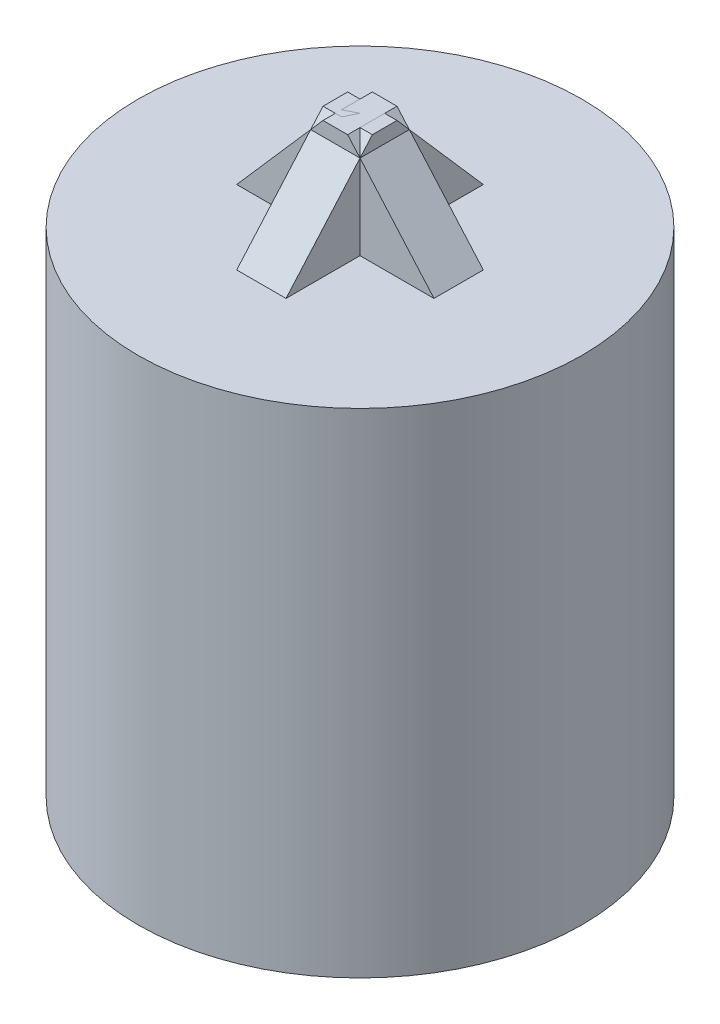
ISO-10303-21;
HEADER;
FILE_DESCRIPTION(('STEP AP214'),'2;1');
FILE_NAME('part.step','',(''),(''),'','','');
FILE_SCHEMA(('AUTOMOTIVE_DESIGN { 1 0 10303 214 1 1 1 1 }'));
ENDSEC;
DATA;
#1=APPLICATION_CONTEXT('core data for automotive mechanical design processes');
#2=APPLICATION_PROTOCOL_DEFINITION('international standard','automotive_design',2000,#1);
#3=PRODUCT_CONTEXT('',#1,'mechanical');
#4=PRODUCT('Part','Part','',(#3));
#5=PRODUCT_RELATED_PRODUCT_CATEGORY('part','',(#4));
#6=PRODUCT_DEFINITION_FORMATION('','',#4);
#7=PRODUCT_DEFINITION_CONTEXT('part definition',#1,'design');
#8=PRODUCT_DEFINITION('design','',#6,#7);
#9=PRODUCT_DEFINITION_SHAPE('','',#8);
#10=(LENGTH_UNIT() NAMED_UNIT(*) SI_UNIT(.MILLI.,.METRE.));
#11=(NAMED_UNIT(*) PLANE_ANGLE_UNIT() SI_UNIT($,.RADIAN.));
#12=(NAMED_UNIT(*) SI_UNIT($,.STERADIAN.) SOLID_ANGLE_UNIT());
#13=UNCERTAINTY_MEASURE_WITH_UNIT(LENGTH_MEASURE(1.E-05),#10,'distance_accuracy_value','');
#14=(GEOMETRIC_REPRESENTATION_CONTEXT(3) GLOBAL_UNCERTAINTY_ASSIGNED_CONTEXT((#13)) GLOBAL_UNIT_ASSIGNED_CONTEXT((#10,
#11,#12)) REPRESENTATION_CONTEXT('',''));
#15=CARTESIAN_POINT('',(0.,0.,0.));
#16=DIRECTION('',(0.,0.,1.));
#17=DIRECTION('',(1.,0.,0.));
#18=AXIS2_PLACEMENT_3D('',#15,#16,#17);
#19=CARTESIAN_POINT('',(0.5,12.,-0.25));
#20=DIRECTION('',(0.,-0.658504607868518,0.752576694706878));
#21=DIRECTION('',(0.,-0.752576694706878,-0.658504607868518));
#22=AXIS2_PLACEMENT_3D('',#19,#20,#21);
#23=PLANE('',#22);
#24=DIRECTION('',(0.,0.752576694706878,0.658504607868518));
#25=VECTOR('',#24,1.);
#26=CARTESIAN_POINT('',(-0.5,12.,-0.25));
#27=LINE('',#26,#25);
#28=CARTESIAN_POINT('',(-0.5,10.,-2.));
#29=VERTEX_POINT('',#28);
#30=CARTESIAN_POINT('',(-0.5,12.,-0.25));
#31=VERTEX_POINT('',#30);
#32=EDGE_CURVE('E106',#29,#31,#27,.T.);
#33=ORIENTED_EDGE('',*,*,#32,.T.);
#34=DIRECTION('',(-1.,0.,0.));
#35=VECTOR('',#34,1.);
#36=CARTESIAN_POINT('',(0.5,12.,-0.25));
#37=LINE('',#36,#35);
#38=CARTESIAN_POINT('',(0.5,12.,-0.25));
#39=VERTEX_POINT('',#38);
#40=EDGE_CURVE('E12',#39,#31,#37,.T.);
#41=ORIENTED_EDGE('',*,*,#40,.F.);
#42=DIRECTION('',(0.,0.752576694706878,0.658504607868518));
#43=VECTOR('',#42,1.);
#44=CARTESIAN_POINT('',(0.5,12.,-0.25));
#45=LINE('',#44,#43);
#46=CARTESIAN_POINT('',(0.5,10.,-2.));
#47=VERTEX_POINT('',#46);
#48=EDGE_CURVE('E94',#47,#39,#45,.T.);
#49=ORIENTED_EDGE('',*,*,#48,.F.);
#50=DIRECTION('',(-1.,0.,0.));
#51=VECTOR('',#50,1.);
#52=CARTESIAN_POINT('',(0.5,10.,-2.));
#53=LINE('',#52,#51);
#54=EDGE_CURVE('E102',#47,#29,#53,.T.);
#55=ORIENTED_EDGE('',*,*,#54,.T.);
#56=EDGE_LOOP('',(#33,#41,#49,#55));
#57=FACE_BOUND('',#56,.T.);
#58=ADVANCED_FACE('F43',(#57),#23,.F.);
#59=CARTESIAN_POINT('',(0.5,12.,0.25));
#60=DIRECTION('',(0.,-1.,0.));
#61=DIRECTION('',(0.,0.,-1.));
#62=AXIS2_PLACEMENT_3D('',#59,#60,#61);
#63=PLANE('',#62);
#64=DIRECTION('',(0.,0.,1.));
#65=VECTOR('',#64,1.);
#66=CARTESIAN_POINT('',(-0.5,12.,0.25));
#67=LINE('',#66,#65);
#68=CARTESIAN_POINT('',(-0.5,12.,0.25));
#69=VERTEX_POINT('',#68);
#70=EDGE_CURVE('E98',#31,#69,#67,.T.);
#71=ORIENTED_EDGE('',*,*,#70,.T.);
#72=DIRECTION('',(-1.,0.,0.));
#73=VECTOR('',#72,1.);
#74=CARTESIAN_POINT('',(0.5,12.,0.25));
#75=LINE('',#74,#73);
#76=CARTESIAN_POINT('',(0.5,12.,0.25));
#77=VERTEX_POINT('',#76);
#78=EDGE_CURVE('E51',#77,#69,#75,.T.);
#79=ORIENTED_EDGE('',*,*,#78,.F.);
#80=DIRECTION('',(0.,0.,1.));
#81=VECTOR('',#80,1.);
#82=CARTESIAN_POINT('',(0.5,12.,0.25));
#83=LINE('',#82,#81);
#84=EDGE_CURVE('E89',#39,#77,#83,.T.);
#85=ORIENTED_EDGE('',*,*,#84,.F.);
#86=ORIENTED_EDGE('',*,*,#40,.T.);
#87=EDGE_LOOP('',(#71,#79,#85,#86));
#88=FACE_BOUND('',#87,.T.);
#89=ADVANCED_FACE('F97',(#88),#63,.F.);
#90=CARTESIAN_POINT('',(0.5,10.,2.));
#91=DIRECTION('',(0.,-0.658504607868518,-0.752576694706878));
#92=DIRECTION('',(0.,0.752576694706878,-0.658504607868518));
#93=AXIS2_PLACEMENT_3D('',#90,#91,#92);
#94=PLANE('',#93);
#95=DIRECTION('',(0.,-0.752576694706878,0.658504607868518));
#96=VECTOR('',#95,1.);
#97=CARTESIAN_POINT('',(-0.5,10.,2.));
#98=LINE('',#97,#96);
#99=CARTESIAN_POINT('',(-0.5,10.,2.));
#100=VERTEX_POINT('',#99);
#101=EDGE_CURVE('E76',#69,#100,#98,.T.);
#102=ORIENTED_EDGE('',*,*,#101,.T.);
#103=DIRECTION('',(-1.,0.,0.));
#104=VECTOR('',#103,1.);
#105=CARTESIAN_POINT('',(0.5,10.,2.));
#106=LINE('',#105,#104);
#107=CARTESIAN_POINT('',(0.5,10.,2.));
#108=VERTEX_POINT('',#107);
#109=EDGE_CURVE('E99',#108,#100,#106,.T.);
#110=ORIENTED_EDGE('',*,*,#109,.F.);
#111=DIRECTION('',(0.,-0.752576694706878,0.658504607868518));
#112=VECTOR('',#111,1.);
#113=CARTESIAN_POINT('',(0.5,10.,2.));
#114=LINE('',#113,#112);
#115=EDGE_CURVE('E92',#77,#108,#114,.T.);
#116=ORIENTED_EDGE('',*,*,#115,.F.);
#117=ORIENTED_EDGE('',*,*,#78,.T.);
#118=EDGE_LOOP('',(#102,#110,#116,#117));
#119=FACE_BOUND('',#118,.T.);
#120=ADVANCED_FACE('F100',(#119),#94,.F.);
#121=CARTESIAN_POINT('',(0.5,10.,-2.));
#122=DIRECTION('',(0.,1.,0.));
#123=DIRECTION('',(0.,0.,1.));
#124=AXIS2_PLACEMENT_3D('',#121,#122,#123);
#125=PLANE('',#124);
#126=DIRECTION('',(0.,0.,-1.));
#127=VECTOR('',#126,1.);
#128=CARTESIAN_POINT('',(-0.5,10.,-2.));
#129=LINE('',#128,#127);
#130=EDGE_CURVE('E82',#100,#29,#129,.T.);
#131=ORIENTED_EDGE('',*,*,#130,.T.);
#132=ORIENTED_EDGE('',*,*,#54,.F.);
#133=DIRECTION('',(0.,0.,-1.));
#134=VECTOR('',#133,1.);
#135=CARTESIAN_POINT('',(0.5,10.,-2.));
#136=LINE('',#135,#134);
#137=EDGE_CURVE('E59',#108,#47,#136,.T.);
#138=ORIENTED_EDGE('',*,*,#137,.F.);
#139=ORIENTED_EDGE('',*,*,#109,.T.);
#140=EDGE_LOOP('',(#131,#132,#138,#139));
#141=FACE_BOUND('',#140,.T.);
#142=ADVANCED_FACE('F113',(#141),#125,.F.);
#143=CARTESIAN_POINT('',(0.5,0.,0.));
#144=DIRECTION('',(1.,0.,0.));
#145=DIRECTION('',(0.,0.,-1.));
#146=AXIS2_PLACEMENT_3D('',#143,#144,#145);
#147=PLANE('',#146);
#148=ORIENTED_EDGE('',*,*,#48,.T.);
#149=ORIENTED_EDGE('',*,*,#84,.T.);
#150=ORIENTED_EDGE('',*,*,#115,.T.);
#151=ORIENTED_EDGE('',*,*,#137,.T.);
#152=EDGE_LOOP('',(#148,#149,#150,#151));
#153=FACE_BOUND('',#152,.T.);
#154=ADVANCED_FACE('F90',(#153),#147,.T.);
#155=CARTESIAN_POINT('',(-0.5,0.,0.));
#156=DIRECTION('',(1.,0.,0.));
#157=DIRECTION('',(0.,0.,-1.));
#158=AXIS2_PLACEMENT_3D('',#155,#156,#157);
#159=PLANE('',#158);
#160=ORIENTED_EDGE('',*,*,#32,.F.);
#161=ORIENTED_EDGE('',*,*,#130,.F.);
#162=ORIENTED_EDGE('',*,*,#101,.F.);
#163=ORIENTED_EDGE('',*,*,#70,.F.);
#164=EDGE_LOOP('',(#160,#161,#162,#163));
#165=FACE_BOUND('',#164,.T.);
#166=ADVANCED_FACE('F116',(#165),#159,.F.);
#167=CLOSED_SHELL('',(#58,#89,#120,#142,#154,#166));
#168=MANIFOLD_SOLID_BREP('B2',#167);
#169=CARTESIAN_POINT('',(0.,0.,0.));
#170=DIRECTION('',(0.,1.,0.));
#171=DIRECTION('',(0.,0.,1.));
#172=AXIS2_PLACEMENT_3D('',#169,#170,#171);
#173=PLANE('',#172);
#174=CARTESIAN_POINT('',(0.,0.,0.));
#175=DIRECTION('',(0.,1.,0.));
#176=DIRECTION('',(0.,0.,1.));
#177=AXIS2_PLACEMENT_3D('',#174,#175,#176);
#178=CIRCLE('',#177,4.5);
#179=CARTESIAN_POINT('',(0.,0.,4.5));
#180=VERTEX_POINT('',#179);
#181=EDGE_CURVE('E171',#180,#180,#178,.T.);
#182=ORIENTED_EDGE('',*,*,#181,.F.);
#183=EDGE_LOOP('',(#182));
#184=FACE_BOUND('',#183,.T.);
#185=DIRECTION('',(0.,0.,1.));
#186=VECTOR('',#185,1.);
#187=CARTESIAN_POINT('',(-1.5,0.,0.));
#188=LINE('',#187,#186);
#189=CARTESIAN_POINT('',(-1.5,0.,-1.5));
#190=VERTEX_POINT('',#189);
#191=CARTESIAN_POINT('',(-1.5,0.,1.5));
#192=VERTEX_POINT('',#191);
#193=EDGE_CURVE('E190',#190,#192,#188,.T.);
#194=ORIENTED_EDGE('',*,*,#193,.T.);
#195=DIRECTION('',(-1.,0.,0.));
#196=VECTOR('',#195,1.);
#197=CARTESIAN_POINT('',(0.,0.,1.5));
#198=LINE('',#197,#196);
#199=CARTESIAN_POINT('',(1.,0.,1.5));
#200=VERTEX_POINT('',#199);
#201=EDGE_CURVE('E265',#200,#192,#198,.T.);
#202=ORIENTED_EDGE('',*,*,#201,.F.);
#203=DIRECTION('',(0.,0.,1.));
#204=VECTOR('',#203,1.);
#205=CARTESIAN_POINT('',(1.,0.,0.));
#206=LINE('',#205,#204);
#207=CARTESIAN_POINT('',(1.,0.,-1.5));
#208=VERTEX_POINT('',#207);
#209=EDGE_CURVE('E276',#208,#200,#206,.T.);
#210=ORIENTED_EDGE('',*,*,#209,.F.);
#211=DIRECTION('',(-1.,0.,0.));
#212=VECTOR('',#211,1.);
#213=CARTESIAN_POINT('',(0.,0.,-1.5));
#214=LINE('',#213,#212);
#215=EDGE_CURVE('E256',#208,#190,#214,.T.);
#216=ORIENTED_EDGE('',*,*,#215,.T.);
#217=EDGE_LOOP('',(#194,#202,#210,#216));
#218=FACE_BOUND('',#217,.T.);
#219=ADVANCED_FACE('F167',(#184,#218),#173,.F.);
#220=CARTESIAN_POINT('',(0.,10.,0.));
#221=DIRECTION('',(0.,-1.,0.));
#222=DIRECTION('',(0.,0.,-1.));
#223=AXIS2_PLACEMENT_3D('',#220,#221,#222);
#224=CYLINDRICAL_SURFACE('',#223,4.5);
#225=CARTESIAN_POINT('',(0.,10.,0.));
#226=DIRECTION('',(0.,1.,0.));
#227=DIRECTION('',(0.,0.,1.));
#228=AXIS2_PLACEMENT_3D('',#225,#226,#227);
#229=CIRCLE('',#228,4.5);
#230=CARTESIAN_POINT('',(0.,10.,4.5));
#231=VERTEX_POINT('',#230);
#232=EDGE_CURVE('E41',#231,#231,#229,.T.);
#233=ORIENTED_EDGE('',*,*,#232,.F.);
#234=EDGE_LOOP('',(#233));
#235=FACE_BOUND('',#234,.T.);
#236=ORIENTED_EDGE('',*,*,#181,.T.);
#237=EDGE_LOOP('',(#236));
#238=FACE_BOUND('',#237,.T.);
#239=ADVANCED_FACE('F169',(#235,#238),#224,.T.);
#240=CARTESIAN_POINT('',(0.,10.,0.));
#241=DIRECTION('',(0.,1.,0.));
#242=DIRECTION('',(0.,0.,1.));
#243=AXIS2_PLACEMENT_3D('',#240,#241,#242);
#244=PLANE('',#243);
#245=DIRECTION('',(1.,0.,0.));
#246=VECTOR('',#245,1.);
#247=CARTESIAN_POINT('',(2.,10.,0.5));
#248=LINE('',#247,#246);
#249=CARTESIAN_POINT('',(-2.,10.,0.5));
#250=VERTEX_POINT('',#249);
#251=CARTESIAN_POINT('',(2.,10.,0.5));
#252=VERTEX_POINT('',#251);
#253=EDGE_CURVE('E249',#250,#252,#248,.T.);
#254=ORIENTED_EDGE('',*,*,#253,.F.);
#255=DIRECTION('',(0.,0.,-1.));
#256=VECTOR('',#255,1.);
#257=CARTESIAN_POINT('',(-2.,10.,0.5));
#258=LINE('',#257,#256);
#259=CARTESIAN_POINT('',(-2.,10.,-0.5));
#260=VERTEX_POINT('',#259);
#261=EDGE_CURVE('E258',#250,#260,#258,.T.);
#262=ORIENTED_EDGE('',*,*,#261,.T.);
#263=DIRECTION('',(1.,0.,0.));
#264=VECTOR('',#263,1.);
#265=CARTESIAN_POINT('',(2.,10.,-0.5));
#266=LINE('',#265,#264);
#267=CARTESIAN_POINT('',(2.,10.,-0.5));
#268=VERTEX_POINT('',#267);
#269=EDGE_CURVE('E252',#260,#268,#266,.T.);
#270=ORIENTED_EDGE('',*,*,#269,.T.);
#271=DIRECTION('',(0.,0.,-1.));
#272=VECTOR('',#271,1.);
#273=CARTESIAN_POINT('',(2.,10.,0.5));
#274=LINE('',#273,#272);
#275=EDGE_CURVE('E424',#252,#268,#274,.T.);
#276=ORIENTED_EDGE('',*,*,#275,.F.);
#277=EDGE_LOOP('',(#254,#262,#270,#276));
#278=FACE_BOUND('',#277,.T.);
#279=ORIENTED_EDGE('',*,*,#232,.T.);
#280=EDGE_LOOP('',(#279));
#281=FACE_BOUND('',#280,.T.);
#282=ADVANCED_FACE('F312',(#278,#281),#244,.T.);
#283=CARTESIAN_POINT('',(-1.5,9.,0.));
#284=DIRECTION('',(1.,0.,0.));
#285=DIRECTION('',(0.,0.,-1.));
#286=AXIS2_PLACEMENT_3D('',#283,#284,#285);
#287=PLANE('',#286);
#288=ORIENTED_EDGE('',*,*,#193,.F.);
#289=DIRECTION('',(0.,-1.,0.));
#290=VECTOR('',#289,1.);
#291=CARTESIAN_POINT('',(-1.5,9.,-1.5));
#292=LINE('',#291,#290);
#293=CARTESIAN_POINT('',(-1.5,9.,-1.5));
#294=VERTEX_POINT('',#293);
#295=EDGE_CURVE('E272',#294,#190,#292,.T.);
#296=ORIENTED_EDGE('',*,*,#295,.F.);
#297=DIRECTION('',(0.,0.,1.));
#298=VECTOR('',#297,1.);
#299=CARTESIAN_POINT('',(-1.5,9.,0.));
#300=LINE('',#299,#298);
#301=CARTESIAN_POINT('',(-1.5,9.,1.5));
#302=VERTEX_POINT('',#301);
#303=EDGE_CURVE('E262',#294,#302,#300,.T.);
#304=ORIENTED_EDGE('',*,*,#303,.T.);
#305=DIRECTION('',(0.,-1.,0.));
#306=VECTOR('',#305,1.);
#307=CARTESIAN_POINT('',(-1.5,9.,1.5));
#308=LINE('',#307,#306);
#309=EDGE_CURVE('E281',#302,#192,#308,.T.);
#310=ORIENTED_EDGE('',*,*,#309,.T.);
#311=EDGE_LOOP('',(#288,#296,#304,#310));
#312=FACE_BOUND('',#311,.T.);
#313=ADVANCED_FACE('F302',(#312),#287,.T.);
#314=CARTESIAN_POINT('',(0.,9.,1.5));
#315=DIRECTION('',(0.,0.,1.));
#316=DIRECTION('',(1.,0.,0.));
#317=AXIS2_PLACEMENT_3D('',#314,#315,#316);
#318=PLANE('',#317);
#319=ORIENTED_EDGE('',*,*,#201,.T.);
#320=ORIENTED_EDGE('',*,*,#309,.F.);
#321=DIRECTION('',(-1.,0.,0.));
#322=VECTOR('',#321,1.);
#323=CARTESIAN_POINT('',(0.,9.,1.5));
#324=LINE('',#323,#322);
#325=CARTESIAN_POINT('',(1.,9.,1.5));
#326=VERTEX_POINT('',#325);
#327=EDGE_CURVE('E270',#326,#302,#324,.T.);
#328=ORIENTED_EDGE('',*,*,#327,.F.);
#329=DIRECTION('',(0.,-1.,0.));
#330=VECTOR('',#329,1.);
#331=CARTESIAN_POINT('',(1.,9.,1.5));
#332=LINE('',#331,#330);
#333=EDGE_CURVE('E283',#326,#200,#332,.T.);
#334=ORIENTED_EDGE('',*,*,#333,.T.);
#335=EDGE_LOOP('',(#319,#320,#328,#334));
#336=FACE_BOUND('',#335,.T.);
#337=ADVANCED_FACE('F304',(#336),#318,.F.);
#338=CARTESIAN_POINT('',(1.,9.,0.));
#339=DIRECTION('',(1.,0.,0.));
#340=DIRECTION('',(0.,0.,-1.));
#341=AXIS2_PLACEMENT_3D('',#338,#339,#340);
#342=PLANE('',#341);
#343=ORIENTED_EDGE('',*,*,#209,.T.);
#344=ORIENTED_EDGE('',*,*,#333,.F.);
#345=DIRECTION('',(0.,0.,1.));
#346=VECTOR('',#345,1.);
#347=CARTESIAN_POINT('',(1.,9.,0.));
#348=LINE('',#347,#346);
#349=CARTESIAN_POINT('',(1.,9.,-1.5));
#350=VERTEX_POINT('',#349);
#351=EDGE_CURVE('E267',#350,#326,#348,.T.);
#352=ORIENTED_EDGE('',*,*,#351,.F.);
#353=DIRECTION('',(0.,-1.,0.));
#354=VECTOR('',#353,1.);
#355=CARTESIAN_POINT('',(1.,9.,-1.5));
#356=LINE('',#355,#354);
#357=EDGE_CURVE('E285',#350,#208,#356,.T.);
#358=ORIENTED_EDGE('',*,*,#357,.T.);
#359=EDGE_LOOP('',(#343,#344,#352,#358));
#360=FACE_BOUND('',#359,.T.);
#361=ADVANCED_FACE('F296',(#360),#342,.F.);
#362=CARTESIAN_POINT('',(0.,9.,-1.5));
#363=DIRECTION('',(0.,0.,1.));
#364=DIRECTION('',(1.,0.,0.));
#365=AXIS2_PLACEMENT_3D('',#362,#363,#364);
#366=PLANE('',#365);
#367=ORIENTED_EDGE('',*,*,#215,.F.);
#368=ORIENTED_EDGE('',*,*,#357,.F.);
#369=DIRECTION('',(-1.,0.,0.));
#370=VECTOR('',#369,1.);
#371=CARTESIAN_POINT('',(0.,9.,-1.5));
#372=LINE('',#371,#370);
#373=EDGE_CURVE('E264',#350,#294,#372,.T.);
#374=ORIENTED_EDGE('',*,*,#373,.T.);
#375=ORIENTED_EDGE('',*,*,#295,.T.);
#376=EDGE_LOOP('',(#367,#368,#374,#375));
#377=FACE_BOUND('',#376,.T.);
#378=ADVANCED_FACE('F289',(#377),#366,.T.);
#379=CARTESIAN_POINT('',(0.,9.,0.));
#380=DIRECTION('',(0.,-1.,0.));
#381=DIRECTION('',(0.,0.,-1.));
#382=AXIS2_PLACEMENT_3D('',#379,#380,#381);
#383=PLANE('',#382);
#384=ORIENTED_EDGE('',*,*,#303,.F.);
#385=ORIENTED_EDGE('',*,*,#373,.F.);
#386=ORIENTED_EDGE('',*,*,#351,.T.);
#387=ORIENTED_EDGE('',*,*,#327,.T.);
#388=EDGE_LOOP('',(#384,#385,#386,#387));
#389=FACE_BOUND('',#388,.T.);
#390=ADVANCED_FACE('F299',(#389),#383,.T.);
#391=CARTESIAN_POINT('',(0.25,12.,0.5));
#392=DIRECTION('',(-0.752576694706878,-0.658504607868518,0.));
#393=DIRECTION('',(0.658504607868518,-0.752576694706878,0.));
#394=AXIS2_PLACEMENT_3D('',#391,#392,#393);
#395=PLANE('',#394);
#396=DIRECTION('',(-0.658504607868518,0.752576694706878,0.));
#397=VECTOR('',#396,1.);
#398=CARTESIAN_POINT('',(0.25,12.,-0.5));
#399=LINE('',#398,#397);
#400=CARTESIAN_POINT('',(0.25,12.,-0.5));
#401=VERTEX_POINT('',#400);
#402=EDGE_CURVE('E182',#268,#401,#399,.T.);
#403=ORIENTED_EDGE('',*,*,#402,.T.);
#404=DIRECTION('',(0.,0.,-1.));
#405=VECTOR('',#404,1.);
#406=CARTESIAN_POINT('',(0.25,12.,0.5));
#407=LINE('',#406,#405);
#408=CARTESIAN_POINT('',(0.25,12.,0.5));
#409=VERTEX_POINT('',#408);
#410=EDGE_CURVE('E238',#409,#401,#407,.T.);
#411=ORIENTED_EDGE('',*,*,#410,.F.);
#412=DIRECTION('',(-0.658504607868518,0.752576694706878,0.));
#413=VECTOR('',#412,1.);
#414=CARTESIAN_POINT('',(0.25,12.,0.5));
#415=LINE('',#414,#413);
#416=EDGE_CURVE('E244',#252,#409,#415,.T.);
#417=ORIENTED_EDGE('',*,*,#416,.F.);
#418=ORIENTED_EDGE('',*,*,#275,.T.);
#419=EDGE_LOOP('',(#403,#411,#417,#418));
#420=FACE_BOUND('',#419,.T.);
#421=ADVANCED_FACE('F254',(#420),#395,.F.);
#422=CARTESIAN_POINT('',(-0.25,12.,0.5));
#423=DIRECTION('',(0.,-1.,0.));
#424=DIRECTION('',(0.,0.,-1.));
#425=AXIS2_PLACEMENT_3D('',#422,#423,#424);
#426=PLANE('',#425);
#427=DIRECTION('',(-1.,0.,0.));
#428=VECTOR('',#427,1.);
#429=CARTESIAN_POINT('',(-0.25,12.,-0.5));
#430=LINE('',#429,#428);
#431=CARTESIAN_POINT('',(-0.25,12.,-0.5));
#432=VERTEX_POINT('',#431);
#433=EDGE_CURVE('E419',#401,#432,#430,.T.);
#434=ORIENTED_EDGE('',*,*,#433,.T.);
#435=DIRECTION('',(0.,0.,-1.));
#436=VECTOR('',#435,1.);
#437=CARTESIAN_POINT('',(-0.25,12.,0.5));
#438=LINE('',#437,#436);
#439=CARTESIAN_POINT('',(-0.25,12.,0.5));
#440=VERTEX_POINT('',#439);
#441=EDGE_CURVE('E240',#440,#432,#438,.T.);
#442=ORIENTED_EDGE('',*,*,#441,.F.);
#443=DIRECTION('',(-1.,0.,0.));
#444=VECTOR('',#443,1.);
#445=CARTESIAN_POINT('',(-0.25,12.,0.5));
#446=LINE('',#445,#444);
#447=EDGE_CURVE('E234',#409,#440,#446,.T.);
#448=ORIENTED_EDGE('',*,*,#447,.F.);
#449=ORIENTED_EDGE('',*,*,#410,.T.);
#450=EDGE_LOOP('',(#434,#442,#448,#449));
#451=FACE_BOUND('',#450,.T.);
#452=ADVANCED_FACE('F236',(#451),#426,.F.);
#453=CARTESIAN_POINT('',(-2.,10.,0.5));
#454=DIRECTION('',(0.752576694706878,-0.658504607868518,0.));
#455=DIRECTION('',(0.658504607868518,0.752576694706878,0.));
#456=AXIS2_PLACEMENT_3D('',#453,#454,#455);
#457=PLANE('',#456);
#458=DIRECTION('',(-0.658504607868518,-0.752576694706878,0.));
#459=VECTOR('',#458,1.);
#460=CARTESIAN_POINT('',(-2.,10.,-0.5));
#461=LINE('',#460,#459);
#462=EDGE_CURVE('E417',#432,#260,#461,.T.);
#463=ORIENTED_EDGE('',*,*,#462,.T.);
#464=ORIENTED_EDGE('',*,*,#261,.F.);
#465=DIRECTION('',(-0.658504607868518,-0.752576694706878,0.));
#466=VECTOR('',#465,1.);
#467=CARTESIAN_POINT('',(-2.,10.,0.5));
#468=LINE('',#467,#466);
#469=EDGE_CURVE('E243',#440,#250,#468,.T.);
#470=ORIENTED_EDGE('',*,*,#469,.F.);
#471=ORIENTED_EDGE('',*,*,#441,.T.);
#472=EDGE_LOOP('',(#463,#464,#470,#471));
#473=FACE_BOUND('',#472,.T.);
#474=ADVANCED_FACE('F337',(#473),#457,.F.);
#475=CARTESIAN_POINT('',(0.,0.,0.5));
#476=DIRECTION('',(0.,0.,1.));
#477=DIRECTION('',(1.,0.,0.));
#478=AXIS2_PLACEMENT_3D('',#475,#476,#477);
#479=PLANE('',#478);
#480=ORIENTED_EDGE('',*,*,#416,.T.);
#481=ORIENTED_EDGE('',*,*,#447,.T.);
#482=ORIENTED_EDGE('',*,*,#469,.T.);
#483=ORIENTED_EDGE('',*,*,#253,.T.);
#484=EDGE_LOOP('',(#480,#481,#482,#483));
#485=FACE_BOUND('',#484,.T.);
#486=ADVANCED_FACE('F247',(#485),#479,.T.);
#487=CARTESIAN_POINT('',(0.,0.,-0.5));
#488=DIRECTION('',(0.,0.,1.));
#489=DIRECTION('',(1.,0.,0.));
#490=AXIS2_PLACEMENT_3D('',#487,#488,#489);
#491=PLANE('',#490);
#492=ORIENTED_EDGE('',*,*,#402,.F.);
#493=ORIENTED_EDGE('',*,*,#269,.F.);
#494=ORIENTED_EDGE('',*,*,#462,.F.);
#495=ORIENTED_EDGE('',*,*,#433,.F.);
#496=EDGE_LOOP('',(#492,#493,#494,#495));
#497=FACE_BOUND('',#496,.T.);
#498=ADVANCED_FACE('F341',(#497),#491,.F.);
#499=CLOSED_SHELL('',(#219,#239,#282,#313,#337,#361,#378,#390,#421,#452,#474,#486,#498));
#500=MANIFOLD_SOLID_BREP('B6',#499);
#501=ADVANCED_BREP_SHAPE_REPRESENTATION('',(#18,#168,#500),#14);
#502=SHAPE_DEFINITION_REPRESENTATION(#9,#501);
ENDSEC;
END-ISO-10303-21;
